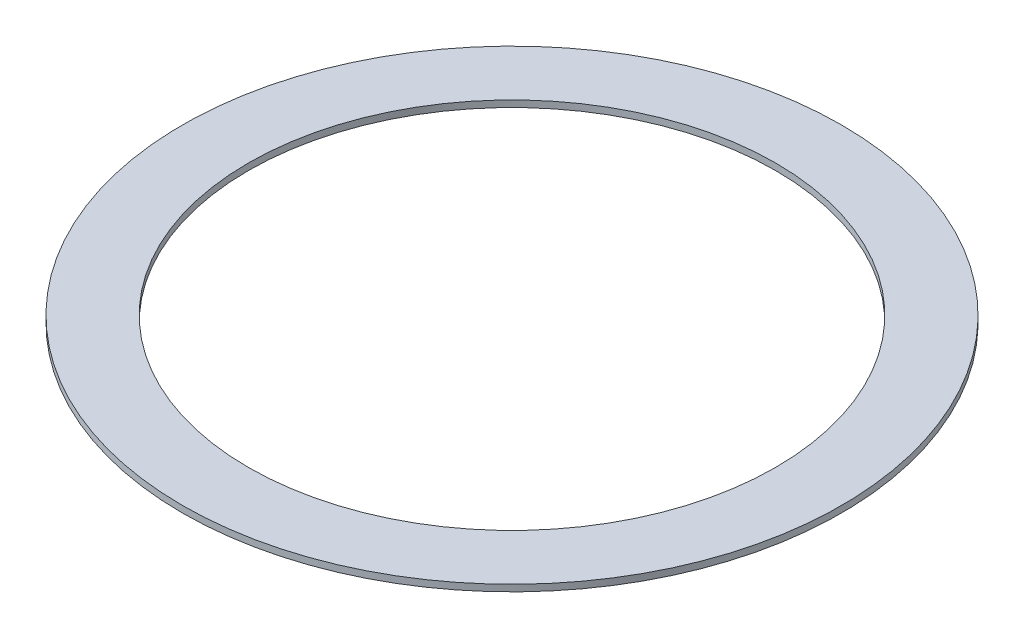
ISO-10303-21;
HEADER;
FILE_DESCRIPTION(('STEP AP214'),'2;1');
FILE_NAME('part.step','',(''),(''),'','','');
FILE_SCHEMA(('AUTOMOTIVE_DESIGN { 1 0 10303 214 1 1 1 1 }'));
ENDSEC;
DATA;
#1=APPLICATION_CONTEXT('core data for automotive mechanical design processes');
#2=APPLICATION_PROTOCOL_DEFINITION('international standard','automotive_design',2000,#1);
#3=PRODUCT_CONTEXT('',#1,'mechanical');
#4=PRODUCT('Part','Part','',(#3));
#5=PRODUCT_RELATED_PRODUCT_CATEGORY('part','',(#4));
#6=PRODUCT_DEFINITION_FORMATION('','',#4);
#7=PRODUCT_DEFINITION_CONTEXT('part definition',#1,'design');
#8=PRODUCT_DEFINITION('design','',#6,#7);
#9=PRODUCT_DEFINITION_SHAPE('','',#8);
#10=(LENGTH_UNIT() NAMED_UNIT(*) SI_UNIT(.MILLI.,.METRE.));
#11=(NAMED_UNIT(*) PLANE_ANGLE_UNIT() SI_UNIT($,.RADIAN.));
#12=(NAMED_UNIT(*) SI_UNIT($,.STERADIAN.) SOLID_ANGLE_UNIT());
#13=UNCERTAINTY_MEASURE_WITH_UNIT(LENGTH_MEASURE(1.E-05),#10,'distance_accuracy_value','');
#14=(GEOMETRIC_REPRESENTATION_CONTEXT(3) GLOBAL_UNCERTAINTY_ASSIGNED_CONTEXT((#13)) GLOBAL_UNIT_ASSIGNED_CONTEXT((#10,
#11,#12)) REPRESENTATION_CONTEXT('',''));
#15=CARTESIAN_POINT('',(0.,0.,0.));
#16=DIRECTION('',(0.,0.,1.));
#17=DIRECTION('',(1.,0.,0.));
#18=AXIS2_PLACEMENT_3D('',#15,#16,#17);
#19=CARTESIAN_POINT('',(0.,2.,0.));
#20=DIRECTION('',(0.,1.,0.));
#21=DIRECTION('',(0.,0.,1.));
#22=AXIS2_PLACEMENT_3D('',#19,#20,#21);
#23=PLANE('',#22);
#24=CARTESIAN_POINT('',(0.,2.,0.));
#25=DIRECTION('',(0.,1.,0.));
#26=DIRECTION('',(0.,0.,1.));
#27=AXIS2_PLACEMENT_3D('',#24,#25,#26);
#28=CIRCLE('',#27,100.);
#29=CARTESIAN_POINT('',(0.,2.,100.));
#30=VERTEX_POINT('',#29);
#31=EDGE_CURVE('E10',#30,#30,#28,.T.);
#32=ORIENTED_EDGE('',*,*,#31,.T.);
#33=EDGE_LOOP('',(#32));
#34=FACE_BOUND('',#33,.T.);
#35=CARTESIAN_POINT('',(0.,2.,0.));
#36=DIRECTION('',(0.,1.,0.));
#37=DIRECTION('',(0.,0.,1.));
#38=AXIS2_PLACEMENT_3D('',#35,#36,#37);
#39=CIRCLE('',#38,80.);
#40=CARTESIAN_POINT('',(0.,2.,80.));
#41=VERTEX_POINT('',#40);
#42=EDGE_CURVE('E50',#41,#41,#39,.T.);
#43=ORIENTED_EDGE('',*,*,#42,.F.);
#44=EDGE_LOOP('',(#43));
#45=FACE_BOUND('',#44,.T.);
#46=ADVANCED_FACE('F39',(#34,#45),#23,.T.);
#47=CARTESIAN_POINT('',(0.,0.,0.));
#48=DIRECTION('',(0.,1.,0.));
#49=DIRECTION('',(0.,0.,1.));
#50=AXIS2_PLACEMENT_3D('',#47,#48,#49);
#51=PLANE('',#50);
#52=CARTESIAN_POINT('',(0.,0.,0.));
#53=DIRECTION('',(0.,1.,0.));
#54=DIRECTION('',(0.,0.,1.));
#55=AXIS2_PLACEMENT_3D('',#52,#53,#54);
#56=CIRCLE('',#55,100.);
#57=CARTESIAN_POINT('',(0.,0.,100.));
#58=VERTEX_POINT('',#57);
#59=EDGE_CURVE('E43',#58,#58,#56,.T.);
#60=ORIENTED_EDGE('',*,*,#59,.F.);
#61=EDGE_LOOP('',(#60));
#62=FACE_BOUND('',#61,.T.);
#63=CARTESIAN_POINT('',(0.,0.,0.));
#64=DIRECTION('',(0.,1.,0.));
#65=DIRECTION('',(0.,0.,1.));
#66=AXIS2_PLACEMENT_3D('',#63,#64,#65);
#67=CIRCLE('',#66,80.);
#68=CARTESIAN_POINT('',(0.,0.,80.));
#69=VERTEX_POINT('',#68);
#70=EDGE_CURVE('E52',#69,#69,#67,.T.);
#71=ORIENTED_EDGE('',*,*,#70,.T.);
#72=EDGE_LOOP('',(#71));
#73=FACE_BOUND('',#72,.T.);
#74=ADVANCED_FACE('F62',(#62,#73),#51,.F.);
#75=CARTESIAN_POINT('',(0.,2.,0.));
#76=DIRECTION('',(0.,-1.,0.));
#77=DIRECTION('',(0.,0.,-1.));
#78=AXIS2_PLACEMENT_3D('',#75,#76,#77);
#79=CYLINDRICAL_SURFACE('',#78,100.);
#80=ORIENTED_EDGE('',*,*,#31,.F.);
#81=EDGE_LOOP('',(#80));
#82=FACE_BOUND('',#81,.T.);
#83=ORIENTED_EDGE('',*,*,#59,.T.);
#84=EDGE_LOOP('',(#83));
#85=FACE_BOUND('',#84,.T.);
#86=ADVANCED_FACE('F41',(#82,#85),#79,.T.);
#87=CARTESIAN_POINT('',(0.,2.,0.));
#88=DIRECTION('',(0.,-1.,0.));
#89=DIRECTION('',(0.,0.,-1.));
#90=AXIS2_PLACEMENT_3D('',#87,#88,#89);
#91=CYLINDRICAL_SURFACE('',#90,80.);
#92=ORIENTED_EDGE('',*,*,#42,.T.);
#93=EDGE_LOOP('',(#92));
#94=FACE_BOUND('',#93,.T.);
#95=ORIENTED_EDGE('',*,*,#70,.F.);
#96=EDGE_LOOP('',(#95));
#97=FACE_BOUND('',#96,.T.);
#98=ADVANCED_FACE('F58',(#94,#97),#91,.F.);
#99=CLOSED_SHELL('',(#46,#74,#86,#98));
#100=MANIFOLD_SOLID_BREP('B2',#99);
#101=ADVANCED_BREP_SHAPE_REPRESENTATION('',(#18,#100),#14);
#102=SHAPE_DEFINITION_REPRESENTATION(#9,#101);
ENDSEC;
END-ISO-10303-21;
